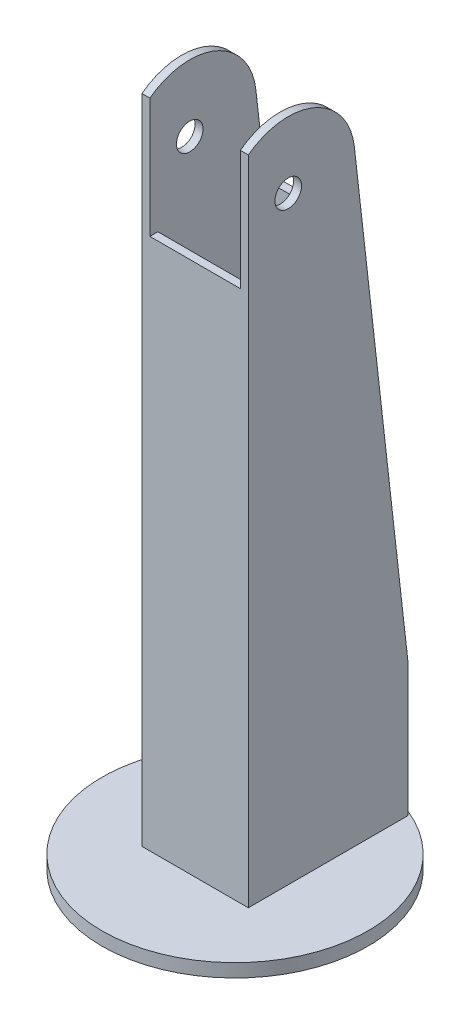
ISO-10303-21;
HEADER;
FILE_DESCRIPTION(('STEP AP214'),'2;1');
FILE_NAME('part.step','',(''),(''),'','','');
FILE_SCHEMA(('AUTOMOTIVE_DESIGN { 1 0 10303 214 1 1 1 1 }'));
ENDSEC;
DATA;
#1=APPLICATION_CONTEXT('core data for automotive mechanical design processes');
#2=APPLICATION_PROTOCOL_DEFINITION('international standard','automotive_design',2000,#1);
#3=PRODUCT_CONTEXT('',#1,'mechanical');
#4=PRODUCT('Part','Part','',(#3));
#5=PRODUCT_RELATED_PRODUCT_CATEGORY('part','',(#4));
#6=PRODUCT_DEFINITION_FORMATION('','',#4);
#7=PRODUCT_DEFINITION_CONTEXT('part definition',#1,'design');
#8=PRODUCT_DEFINITION('design','',#6,#7);
#9=PRODUCT_DEFINITION_SHAPE('','',#8);
#10=(LENGTH_UNIT() NAMED_UNIT(*) SI_UNIT(.MILLI.,.METRE.));
#11=(NAMED_UNIT(*) PLANE_ANGLE_UNIT() SI_UNIT($,.RADIAN.));
#12=(NAMED_UNIT(*) SI_UNIT($,.STERADIAN.) SOLID_ANGLE_UNIT());
#13=UNCERTAINTY_MEASURE_WITH_UNIT(LENGTH_MEASURE(1.E-05),#10,'distance_accuracy_value','');
#14=(GEOMETRIC_REPRESENTATION_CONTEXT(3) GLOBAL_UNCERTAINTY_ASSIGNED_CONTEXT((#13)) GLOBAL_UNIT_ASSIGNED_CONTEXT((#10,
#11,#12)) REPRESENTATION_CONTEXT('',''));
#15=CARTESIAN_POINT('',(0.,0.,0.));
#16=DIRECTION('',(0.,0.,1.));
#17=DIRECTION('',(1.,0.,0.));
#18=AXIS2_PLACEMENT_3D('',#15,#16,#17);
#19=CARTESIAN_POINT('',(-17.,200.,-30.));
#20=DIRECTION('',(0.,-1.,0.));
#21=DIRECTION('',(0.,0.,-1.));
#22=AXIS2_PLACEMENT_3D('',#19,#20,#21);
#23=PLANE('',#22);
#24=DIRECTION('',(0.,0.,1.));
#25=VECTOR('',#24,1.);
#26=CARTESIAN_POINT('',(-17.,200.,30.));
#27=LINE('',#26,#25);
#28=CARTESIAN_POINT('',(-17.,200.,-12.9944127102166));
#29=VERTEX_POINT('',#28);
#30=CARTESIAN_POINT('',(-17.,200.,-9.9944127102166));
#31=VERTEX_POINT('',#30);
#32=EDGE_CURVE('E201',#29,#31,#27,.T.);
#33=ORIENTED_EDGE('',*,*,#32,.T.);
#34=DIRECTION('',(-1.,0.,0.));
#35=VECTOR('',#34,1.);
#36=CARTESIAN_POINT('',(17.,200.,-9.99441271021659));
#37=LINE('',#36,#35);
#38=CARTESIAN_POINT('',(17.,200.,-9.99441271021659));
#39=VERTEX_POINT('',#38);
#40=EDGE_CURVE('E146',#39,#31,#37,.T.);
#41=ORIENTED_EDGE('',*,*,#40,.F.);
#42=DIRECTION('',(0.,0.,-1.));
#43=VECTOR('',#42,1.);
#44=CARTESIAN_POINT('',(17.,200.,30.));
#45=LINE('',#44,#43);
#46=CARTESIAN_POINT('',(17.,200.,-12.9944127102166));
#47=VERTEX_POINT('',#46);
#48=EDGE_CURVE('E207',#39,#47,#45,.T.);
#49=ORIENTED_EDGE('',*,*,#48,.T.);
#50=DIRECTION('',(1.,0.,0.));
#51=VECTOR('',#50,1.);
#52=CARTESIAN_POINT('',(-17.,200.,-12.9944127102166));
#53=LINE('',#52,#51);
#54=EDGE_CURVE('E241',#29,#47,#53,.T.);
#55=ORIENTED_EDGE('',*,*,#54,.F.);
#56=EDGE_LOOP('',(#33,#41,#49,#55));
#57=FACE_BOUND('',#56,.T.);
#58=ADVANCED_FACE('F33',(#57),#23,.F.);
#59=CARTESIAN_POINT('',(20.,250.,30.));
#60=DIRECTION('',(-1.,0.,0.));
#61=DIRECTION('',(0.,0.,1.));
#62=AXIS2_PLACEMENT_3D('',#59,#60,#61);
#63=PLANE('',#62);
#64=CARTESIAN_POINT('',(20.,225.,15.));
#65=DIRECTION('',(1.,0.,0.));
#66=DIRECTION('',(0.,0.,-1.));
#67=AXIS2_PLACEMENT_3D('',#64,#65,#66);
#68=CIRCLE('',#67,5.);
#69=CARTESIAN_POINT('',(20.,225.,10.));
#70=VERTEX_POINT('',#69);
#71=EDGE_CURVE('E191',#70,#70,#68,.T.);
#72=ORIENTED_EDGE('',*,*,#71,.F.);
#73=EDGE_LOOP('',(#72));
#74=FACE_BOUND('',#73,.T.);
#75=CARTESIAN_POINT('',(20.,225.,15.));
#76=DIRECTION('',(1.,0.,0.));
#77=DIRECTION('',(0.,0.,-1.));
#78=AXIS2_PLACEMENT_3D('',#75,#76,#77);
#79=CIRCLE('',#78,25.);
#80=CARTESIAN_POINT('',(20.,227.816224024256,-9.84087120543892));
#81=VERTEX_POINT('',#80);
#82=CARTESIAN_POINT('',(20.,245.,30.));
#83=VERTEX_POINT('',#82);
#84=EDGE_CURVE('E169',#81,#83,#79,.T.);
#85=ORIENTED_EDGE('',*,*,#84,.T.);
#86=DIRECTION('',(0.,-1.,0.));
#87=VECTOR('',#86,1.);
#88=CARTESIAN_POINT('',(20.,250.,30.));
#89=LINE('',#88,#87);
#90=CARTESIAN_POINT('',(20.,0.,30.));
#91=VERTEX_POINT('',#90);
#92=EDGE_CURVE('E229',#83,#91,#89,.T.);
#93=ORIENTED_EDGE('',*,*,#92,.T.);
#94=DIRECTION('',(0.,0.,-1.));
#95=VECTOR('',#94,1.);
#96=CARTESIAN_POINT('',(20.,0.,30.));
#97=LINE('',#96,#95);
#98=CARTESIAN_POINT('',(20.,0.,-30.));
#99=VERTEX_POINT('',#98);
#100=EDGE_CURVE('E215',#91,#99,#97,.T.);
#101=ORIENTED_EDGE('',*,*,#100,.T.);
#102=DIRECTION('',(0.,-1.,0.));
#103=VECTOR('',#102,1.);
#104=CARTESIAN_POINT('',(20.,250.,-30.));
#105=LINE('',#104,#103);
#106=CARTESIAN_POINT('',(20.,50.0000000000004,-30.));
#107=VERTEX_POINT('',#106);
#108=EDGE_CURVE('E238',#107,#99,#105,.T.);
#109=ORIENTED_EDGE('',*,*,#108,.F.);
#110=DIRECTION('',(0.,0.993634848217557,0.112648960970229));
#111=VECTOR('',#110,1.);
#112=CARTESIAN_POINT('',(20.,105.006666194857,-23.7638622433559));
#113=LINE('',#112,#111);
#114=EDGE_CURVE('E173',#107,#81,#113,.T.);
#115=ORIENTED_EDGE('',*,*,#114,.T.);
#116=EDGE_LOOP('',(#85,#93,#101,#109,#115));
#117=FACE_BOUND('',#116,.T.);
#118=ADVANCED_FACE('F35',(#74,#117),#63,.F.);
#119=CARTESIAN_POINT('',(-20.,250.,30.));
#120=DIRECTION('',(1.,0.,0.));
#121=DIRECTION('',(0.,0.,-1.));
#122=AXIS2_PLACEMENT_3D('',#119,#120,#121);
#123=PLANE('',#122);
#124=CARTESIAN_POINT('',(-20.,225.,15.));
#125=DIRECTION('',(1.,0.,0.));
#126=DIRECTION('',(0.,0.,-1.));
#127=AXIS2_PLACEMENT_3D('',#124,#125,#126);
#128=CIRCLE('',#127,5.);
#129=CARTESIAN_POINT('',(-20.,225.,10.));
#130=VERTEX_POINT('',#129);
#131=EDGE_CURVE('E192',#130,#130,#128,.T.);
#132=ORIENTED_EDGE('',*,*,#131,.T.);
#133=EDGE_LOOP('',(#132));
#134=FACE_BOUND('',#133,.T.);
#135=DIRECTION('',(0.,-1.,0.));
#136=VECTOR('',#135,1.);
#137=CARTESIAN_POINT('',(-20.,250.,30.));
#138=LINE('',#137,#136);
#139=CARTESIAN_POINT('',(-20.,245.,30.));
#140=VERTEX_POINT('',#139);
#141=CARTESIAN_POINT('',(-20.,0.,30.));
#142=VERTEX_POINT('',#141);
#143=EDGE_CURVE('E232',#140,#142,#138,.T.);
#144=ORIENTED_EDGE('',*,*,#143,.F.);
#145=CARTESIAN_POINT('',(-20.,225.,15.));
#146=DIRECTION('',(1.,0.,0.));
#147=DIRECTION('',(0.,0.,-1.));
#148=AXIS2_PLACEMENT_3D('',#145,#146,#147);
#149=CIRCLE('',#148,25.);
#150=CARTESIAN_POINT('',(-20.,227.816224024256,-9.84087120543892));
#151=VERTEX_POINT('',#150);
#152=EDGE_CURVE('E170',#151,#140,#149,.T.);
#153=ORIENTED_EDGE('',*,*,#152,.F.);
#154=DIRECTION('',(0.,0.993634848217557,0.112648960970229));
#155=VECTOR('',#154,1.);
#156=CARTESIAN_POINT('',(-20.,105.006666194857,-23.7638622433559));
#157=LINE('',#156,#155);
#158=CARTESIAN_POINT('',(-20.,50.0000000000004,-30.));
#159=VERTEX_POINT('',#158);
#160=EDGE_CURVE('E172',#159,#151,#157,.T.);
#161=ORIENTED_EDGE('',*,*,#160,.F.);
#162=DIRECTION('',(0.,-1.,0.));
#163=VECTOR('',#162,1.);
#164=CARTESIAN_POINT('',(-20.,250.,-30.));
#165=LINE('',#164,#163);
#166=CARTESIAN_POINT('',(-20.,0.,-30.));
#167=VERTEX_POINT('',#166);
#168=EDGE_CURVE('E235',#159,#167,#165,.T.);
#169=ORIENTED_EDGE('',*,*,#168,.T.);
#170=DIRECTION('',(0.,0.,1.));
#171=VECTOR('',#170,1.);
#172=CARTESIAN_POINT('',(-20.,0.,30.));
#173=LINE('',#172,#171);
#174=EDGE_CURVE('E223',#167,#142,#173,.T.);
#175=ORIENTED_EDGE('',*,*,#174,.T.);
#176=EDGE_LOOP('',(#144,#153,#161,#169,#175));
#177=FACE_BOUND('',#176,.T.);
#178=ADVANCED_FACE('F270',(#134,#177),#123,.F.);
#179=CARTESIAN_POINT('',(-17.,200.,30.));
#180=DIRECTION('',(-1.,0.,0.));
#181=DIRECTION('',(0.,0.,1.));
#182=AXIS2_PLACEMENT_3D('',#179,#180,#181);
#183=PLANE('',#182);
#184=CARTESIAN_POINT('',(-17.,225.,15.));
#185=DIRECTION('',(-1.,0.,0.));
#186=DIRECTION('',(0.,0.,1.));
#187=AXIS2_PLACEMENT_3D('',#184,#185,#186);
#188=CIRCLE('',#187,5.);
#189=CARTESIAN_POINT('',(-17.,225.,20.));
#190=VERTEX_POINT('',#189);
#191=EDGE_CURVE('E198',#190,#190,#188,.T.);
#192=ORIENTED_EDGE('',*,*,#191,.T.);
#193=EDGE_LOOP('',(#192));
#194=FACE_BOUND('',#193,.T.);
#195=CARTESIAN_POINT('',(-17.,225.,15.));
#196=DIRECTION('',(-1.,0.,0.));
#197=DIRECTION('',(0.,0.,1.));
#198=AXIS2_PLACEMENT_3D('',#195,#196,#197);
#199=CIRCLE('',#198,25.);
#200=CARTESIAN_POINT('',(-17.,245.,30.));
#201=VERTEX_POINT('',#200);
#202=CARTESIAN_POINT('',(-17.,227.816224024256,-9.84087120543892));
#203=VERTEX_POINT('',#202);
#204=EDGE_CURVE('E189',#201,#203,#199,.T.);
#205=ORIENTED_EDGE('',*,*,#204,.F.);
#206=DIRECTION('',(0.,1.,0.));
#207=VECTOR('',#206,1.);
#208=CARTESIAN_POINT('',(-17.,200.,30.));
#209=LINE('',#208,#207);
#210=CARTESIAN_POINT('',(-17.,200.,30.));
#211=VERTEX_POINT('',#210);
#212=EDGE_CURVE('E211',#211,#201,#209,.T.);
#213=ORIENTED_EDGE('',*,*,#212,.F.);
#214=CARTESIAN_POINT('',(-17.,200.,27.));
#215=VERTEX_POINT('',#214);
#216=EDGE_CURVE('E134',#215,#211,#27,.T.);
#217=ORIENTED_EDGE('',*,*,#216,.F.);
#218=DIRECTION('',(0.,1.,0.));
#219=VECTOR('',#218,1.);
#220=CARTESIAN_POINT('',(-17.,-5.,27.));
#221=LINE('',#220,#219);
#222=CARTESIAN_POINT('',(-17.,-5.,27.));
#223=VERTEX_POINT('',#222);
#224=EDGE_CURVE('E48',#223,#215,#221,.T.);
#225=ORIENTED_EDGE('',*,*,#224,.F.);
#226=DIRECTION('',(0.,0.,1.));
#227=VECTOR('',#226,1.);
#228=CARTESIAN_POINT('',(-17.,-5.,27.));
#229=LINE('',#228,#227);
#230=CARTESIAN_POINT('',(-17.,-5.,-9.9944127102166));
#231=VERTEX_POINT('',#230);
#232=EDGE_CURVE('E131',#231,#223,#229,.T.);
#233=ORIENTED_EDGE('',*,*,#232,.F.);
#234=DIRECTION('',(0.,1.,0.));
#235=VECTOR('',#234,1.);
#236=CARTESIAN_POINT('',(-17.,-5.,-9.9944127102166));
#237=LINE('',#236,#235);
#238=EDGE_CURVE('E155',#231,#31,#237,.T.);
#239=ORIENTED_EDGE('',*,*,#238,.T.);
#240=ORIENTED_EDGE('',*,*,#32,.F.);
#241=DIRECTION('',(0.,-0.993634848217557,-0.112648960970229));
#242=VECTOR('',#241,1.);
#243=CARTESIAN_POINT('',(-17.,204.81244773298,-12.4488227102118));
#244=LINE('',#243,#242);
#245=EDGE_CURVE('E187',#203,#29,#244,.T.);
#246=ORIENTED_EDGE('',*,*,#245,.F.);
#247=EDGE_LOOP('',(#205,#213,#217,#225,#233,#239,#240,#246));
#248=FACE_BOUND('',#247,.T.);
#249=ADVANCED_FACE('F129',(#194,#248),#183,.F.);
#250=CARTESIAN_POINT('',(17.,200.,30.));
#251=DIRECTION('',(1.,0.,0.));
#252=DIRECTION('',(0.,0.,-1.));
#253=AXIS2_PLACEMENT_3D('',#250,#251,#252);
#254=PLANE('',#253);
#255=CARTESIAN_POINT('',(17.,225.,15.));
#256=DIRECTION('',(1.,0.,0.));
#257=DIRECTION('',(0.,0.,-1.));
#258=AXIS2_PLACEMENT_3D('',#255,#256,#257);
#259=CIRCLE('',#258,5.);
#260=CARTESIAN_POINT('',(17.,225.,10.));
#261=VERTEX_POINT('',#260);
#262=EDGE_CURVE('E195',#261,#261,#259,.T.);
#263=ORIENTED_EDGE('',*,*,#262,.T.);
#264=EDGE_LOOP('',(#263));
#265=FACE_BOUND('',#264,.T.);
#266=DIRECTION('',(0.,1.,0.));
#267=VECTOR('',#266,1.);
#268=CARTESIAN_POINT('',(17.,200.,30.));
#269=LINE('',#268,#267);
#270=CARTESIAN_POINT('',(17.,200.,30.));
#271=VERTEX_POINT('',#270);
#272=CARTESIAN_POINT('',(17.,245.,30.));
#273=VERTEX_POINT('',#272);
#274=EDGE_CURVE('E212',#271,#273,#269,.T.);
#275=ORIENTED_EDGE('',*,*,#274,.T.);
#276=CARTESIAN_POINT('',(17.,225.,15.));
#277=DIRECTION('',(1.,0.,0.));
#278=DIRECTION('',(0.,0.,-1.));
#279=AXIS2_PLACEMENT_3D('',#276,#277,#278);
#280=CIRCLE('',#279,25.);
#281=CARTESIAN_POINT('',(17.,227.816224024256,-9.84087120543892));
#282=VERTEX_POINT('',#281);
#283=EDGE_CURVE('E41',#282,#273,#280,.T.);
#284=ORIENTED_EDGE('',*,*,#283,.F.);
#285=DIRECTION('',(0.,0.993634848217557,0.112648960970229));
#286=VECTOR('',#285,1.);
#287=CARTESIAN_POINT('',(17.,204.81244773298,-12.4488227102118));
#288=LINE('',#287,#286);
#289=EDGE_CURVE('E182',#47,#282,#288,.T.);
#290=ORIENTED_EDGE('',*,*,#289,.F.);
#291=ORIENTED_EDGE('',*,*,#48,.F.);
#292=DIRECTION('',(0.,1.,0.));
#293=VECTOR('',#292,1.);
#294=CARTESIAN_POINT('',(17.,-5.,-9.99441271021659));
#295=LINE('',#294,#293);
#296=CARTESIAN_POINT('',(17.,-5.,-9.99441271021659));
#297=VERTEX_POINT('',#296);
#298=EDGE_CURVE('E158',#297,#39,#295,.T.);
#299=ORIENTED_EDGE('',*,*,#298,.F.);
#300=DIRECTION('',(0.,0.,-1.));
#301=VECTOR('',#300,1.);
#302=CARTESIAN_POINT('',(17.,-5.,27.));
#303=LINE('',#302,#301);
#304=CARTESIAN_POINT('',(17.,-5.,27.));
#305=VERTEX_POINT('',#304);
#306=EDGE_CURVE('E56',#305,#297,#303,.T.);
#307=ORIENTED_EDGE('',*,*,#306,.F.);
#308=DIRECTION('',(0.,1.,0.));
#309=VECTOR('',#308,1.);
#310=CARTESIAN_POINT('',(17.,-5.,27.));
#311=LINE('',#310,#309);
#312=CARTESIAN_POINT('',(17.,200.,27.));
#313=VERTEX_POINT('',#312);
#314=EDGE_CURVE('E135',#305,#313,#311,.T.);
#315=ORIENTED_EDGE('',*,*,#314,.T.);
#316=EDGE_CURVE('E208',#271,#313,#45,.T.);
#317=ORIENTED_EDGE('',*,*,#316,.F.);
#318=EDGE_LOOP('',(#275,#284,#290,#291,#299,#307,#315,#317));
#319=FACE_BOUND('',#318,.T.);
#320=ADVANCED_FACE('F258',(#265,#319),#254,.F.);
#321=CARTESIAN_POINT('',(-20.,250.,30.));
#322=DIRECTION('',(0.,0.,-1.));
#323=DIRECTION('',(-1.,0.,0.));
#324=AXIS2_PLACEMENT_3D('',#321,#322,#323);
#325=PLANE('',#324);
#326=DIRECTION('',(1.,0.,0.));
#327=VECTOR('',#326,1.);
#328=CARTESIAN_POINT('',(-20.,245.,30.));
#329=LINE('',#328,#327);
#330=EDGE_CURVE('E164',#140,#201,#329,.T.);
#331=ORIENTED_EDGE('',*,*,#330,.F.);
#332=ORIENTED_EDGE('',*,*,#143,.T.);
#333=DIRECTION('',(1.,0.,0.));
#334=VECTOR('',#333,1.);
#335=CARTESIAN_POINT('',(-20.,0.,30.));
#336=LINE('',#335,#334);
#337=EDGE_CURVE('E226',#142,#91,#336,.T.);
#338=ORIENTED_EDGE('',*,*,#337,.T.);
#339=ORIENTED_EDGE('',*,*,#92,.F.);
#340=DIRECTION('',(1.,0.,0.));
#341=VECTOR('',#340,1.);
#342=CARTESIAN_POINT('',(-20.,245.,30.));
#343=LINE('',#342,#341);
#344=EDGE_CURVE('E11',#273,#83,#343,.T.);
#345=ORIENTED_EDGE('',*,*,#344,.F.);
#346=ORIENTED_EDGE('',*,*,#274,.F.);
#347=DIRECTION('',(1.,0.,0.));
#348=VECTOR('',#347,1.);
#349=CARTESIAN_POINT('',(-17.,200.,30.));
#350=LINE('',#349,#348);
#351=EDGE_CURVE('E204',#211,#271,#350,.T.);
#352=ORIENTED_EDGE('',*,*,#351,.F.);
#353=ORIENTED_EDGE('',*,*,#212,.T.);
#354=EDGE_LOOP('',(#331,#332,#338,#339,#345,#346,#352,#353));
#355=FACE_BOUND('',#354,.T.);
#356=ADVANCED_FACE('F256',(#355),#325,.F.);
#357=CARTESIAN_POINT('',(-20.,250.,-30.));
#358=DIRECTION('',(0.,0.,1.));
#359=DIRECTION('',(1.,0.,0.));
#360=AXIS2_PLACEMENT_3D('',#357,#358,#359);
#361=PLANE('',#360);
#362=DIRECTION('',(1.,0.,0.));
#363=VECTOR('',#362,1.);
#364=CARTESIAN_POINT('',(-20.,50.0000000000004,-30.));
#365=LINE('',#364,#363);
#366=EDGE_CURVE('E179',#159,#107,#365,.T.);
#367=ORIENTED_EDGE('',*,*,#366,.T.);
#368=ORIENTED_EDGE('',*,*,#108,.T.);
#369=DIRECTION('',(-1.,0.,0.));
#370=VECTOR('',#369,1.);
#371=CARTESIAN_POINT('',(-20.,0.,-30.));
#372=LINE('',#371,#370);
#373=EDGE_CURVE('E220',#99,#167,#372,.T.);
#374=ORIENTED_EDGE('',*,*,#373,.T.);
#375=ORIENTED_EDGE('',*,*,#168,.F.);
#376=EDGE_LOOP('',(#367,#368,#374,#375));
#377=FACE_BOUND('',#376,.T.);
#378=ADVANCED_FACE('F279',(#377),#361,.F.);
#379=ORIENTED_EDGE('',*,*,#316,.T.);
#380=DIRECTION('',(1.,0.,0.));
#381=VECTOR('',#380,1.);
#382=CARTESIAN_POINT('',(17.,200.,27.));
#383=LINE('',#382,#381);
#384=EDGE_CURVE('E149',#215,#313,#383,.T.);
#385=ORIENTED_EDGE('',*,*,#384,.F.);
#386=ORIENTED_EDGE('',*,*,#216,.T.);
#387=ORIENTED_EDGE('',*,*,#351,.T.);
#388=EDGE_LOOP('',(#379,#385,#386,#387));
#389=FACE_BOUND('',#388,.T.);
#390=ADVANCED_FACE('F260',(#389),#23,.F.);
#391=CARTESIAN_POINT('',(-20.,225.,15.));
#392=DIRECTION('',(1.,0.,0.));
#393=DIRECTION('',(0.,0.,-1.));
#394=AXIS2_PLACEMENT_3D('',#391,#392,#393);
#395=CYLINDRICAL_SURFACE('',#394,5.);
#396=ORIENTED_EDGE('',*,*,#71,.T.);
#397=EDGE_LOOP('',(#396));
#398=FACE_BOUND('',#397,.T.);
#399=ORIENTED_EDGE('',*,*,#262,.F.);
#400=EDGE_LOOP('',(#399));
#401=FACE_BOUND('',#400,.T.);
#402=ADVANCED_FACE('F285',(#398,#401),#395,.F.);
#403=ORIENTED_EDGE('',*,*,#131,.F.);
#404=EDGE_LOOP('',(#403));
#405=FACE_BOUND('',#404,.T.);
#406=ORIENTED_EDGE('',*,*,#191,.F.);
#407=EDGE_LOOP('',(#406));
#408=FACE_BOUND('',#407,.T.);
#409=ADVANCED_FACE('F297',(#405,#408),#395,.F.);
#410=CARTESIAN_POINT('',(-20.,225.,15.));
#411=DIRECTION('',(1.,0.,0.));
#412=DIRECTION('',(0.,0.,-1.));
#413=AXIS2_PLACEMENT_3D('',#410,#411,#412);
#414=CYLINDRICAL_SURFACE('',#413,25.);
#415=ORIENTED_EDGE('',*,*,#204,.T.);
#416=DIRECTION('',(1.,0.,0.));
#417=VECTOR('',#416,1.);
#418=CARTESIAN_POINT('',(-20.,227.816224024256,-9.84087120543892));
#419=LINE('',#418,#417);
#420=EDGE_CURVE('E183',#151,#203,#419,.T.);
#421=ORIENTED_EDGE('',*,*,#420,.F.);
#422=ORIENTED_EDGE('',*,*,#152,.T.);
#423=ORIENTED_EDGE('',*,*,#330,.T.);
#424=EDGE_LOOP('',(#415,#421,#422,#423));
#425=FACE_BOUND('',#424,.T.);
#426=ADVANCED_FACE('F266',(#425),#414,.T.);
#427=ORIENTED_EDGE('',*,*,#283,.T.);
#428=ORIENTED_EDGE('',*,*,#344,.T.);
#429=ORIENTED_EDGE('',*,*,#84,.F.);
#430=EDGE_CURVE('E175',#282,#81,#419,.T.);
#431=ORIENTED_EDGE('',*,*,#430,.F.);
#432=EDGE_LOOP('',(#427,#428,#429,#431));
#433=FACE_BOUND('',#432,.T.);
#434=ADVANCED_FACE('F249',(#433),#414,.T.);
#435=CARTESIAN_POINT('',(-20.,105.006666194857,-23.7638622433559));
#436=DIRECTION('',(0.,0.112648960970229,-0.993634848217557));
#437=DIRECTION('',(0.,0.993634848217557,0.112648960970229));
#438=AXIS2_PLACEMENT_3D('',#435,#436,#437);
#439=PLANE('',#438);
#440=ORIENTED_EDGE('',*,*,#245,.T.);
#441=ORIENTED_EDGE('',*,*,#54,.T.);
#442=ORIENTED_EDGE('',*,*,#289,.T.);
#443=ORIENTED_EDGE('',*,*,#430,.T.);
#444=ORIENTED_EDGE('',*,*,#114,.F.);
#445=ORIENTED_EDGE('',*,*,#366,.F.);
#446=ORIENTED_EDGE('',*,*,#160,.T.);
#447=ORIENTED_EDGE('',*,*,#420,.T.);
#448=EDGE_LOOP('',(#440,#441,#442,#443,#444,#445,#446,#447));
#449=FACE_BOUND('',#448,.T.);
#450=ADVANCED_FACE('F277',(#449),#439,.T.);
#451=CARTESIAN_POINT('',(0.,0.,15.));
#452=DIRECTION('',(0.,-1.,0.));
#453=DIRECTION('',(0.,0.,-1.));
#454=AXIS2_PLACEMENT_3D('',#451,#452,#453);
#455=PLANE('',#454);
#456=CARTESIAN_POINT('',(0.,0.,15.));
#457=DIRECTION('',(0.,-1.,0.));
#458=DIRECTION('',(0.,0.,-1.));
#459=AXIS2_PLACEMENT_3D('',#456,#457,#458);
#460=CIRCLE('',#459,50.);
#461=CARTESIAN_POINT('',(0.,0.,-35.));
#462=VERTEX_POINT('',#461);
#463=EDGE_CURVE('E157',#462,#462,#460,.T.);
#464=ORIENTED_EDGE('',*,*,#463,.F.);
#465=EDGE_LOOP('',(#464));
#466=FACE_BOUND('',#465,.T.);
#467=ORIENTED_EDGE('',*,*,#100,.F.);
#468=ORIENTED_EDGE('',*,*,#337,.F.);
#469=ORIENTED_EDGE('',*,*,#174,.F.);
#470=ORIENTED_EDGE('',*,*,#373,.F.);
#471=EDGE_LOOP('',(#467,#468,#469,#470));
#472=FACE_BOUND('',#471,.T.);
#473=ADVANCED_FACE('F273',(#466,#472),#455,.F.);
#474=CARTESIAN_POINT('',(0.,-5.,15.));
#475=DIRECTION('',(0.,1.,0.));
#476=DIRECTION('',(0.,0.,1.));
#477=AXIS2_PLACEMENT_3D('',#474,#475,#476);
#478=CYLINDRICAL_SURFACE('',#477,50.);
#479=CARTESIAN_POINT('',(0.,-5.,15.));
#480=DIRECTION('',(0.,-1.,0.));
#481=DIRECTION('',(0.,0.,-1.));
#482=AXIS2_PLACEMENT_3D('',#479,#480,#481);
#483=CIRCLE('',#482,50.);
#484=CARTESIAN_POINT('',(0.,-5.,-35.));
#485=VERTEX_POINT('',#484);
#486=EDGE_CURVE('E161',#485,#485,#483,.T.);
#487=ORIENTED_EDGE('',*,*,#486,.F.);
#488=EDGE_LOOP('',(#487));
#489=FACE_BOUND('',#488,.T.);
#490=ORIENTED_EDGE('',*,*,#463,.T.);
#491=EDGE_LOOP('',(#490));
#492=FACE_BOUND('',#491,.T.);
#493=ADVANCED_FACE('F343',(#489,#492),#478,.T.);
#494=CARTESIAN_POINT('',(0.,-5.,15.));
#495=DIRECTION('',(0.,-1.,0.));
#496=DIRECTION('',(0.,0.,-1.));
#497=AXIS2_PLACEMENT_3D('',#494,#495,#496);
#498=PLANE('',#497);
#499=ORIENTED_EDGE('',*,*,#232,.T.);
#500=DIRECTION('',(1.,0.,0.));
#501=VECTOR('',#500,1.);
#502=CARTESIAN_POINT('',(17.,-5.,27.));
#503=LINE('',#502,#501);
#504=EDGE_CURVE('E139',#223,#305,#503,.T.);
#505=ORIENTED_EDGE('',*,*,#504,.T.);
#506=ORIENTED_EDGE('',*,*,#306,.T.);
#507=DIRECTION('',(-1.,0.,0.));
#508=VECTOR('',#507,1.);
#509=CARTESIAN_POINT('',(17.,-5.,-9.99441271021659));
#510=LINE('',#509,#508);
#511=EDGE_CURVE('E136',#297,#231,#510,.T.);
#512=ORIENTED_EDGE('',*,*,#511,.T.);
#513=EDGE_LOOP('',(#499,#505,#506,#512));
#514=FACE_BOUND('',#513,.T.);
#515=ORIENTED_EDGE('',*,*,#486,.T.);
#516=EDGE_LOOP('',(#515));
#517=FACE_BOUND('',#516,.T.);
#518=ADVANCED_FACE('F143',(#514,#517),#498,.T.);
#519=CARTESIAN_POINT('',(17.,-5.,-9.99441271021659));
#520=DIRECTION('',(0.,0.,-1.));
#521=DIRECTION('',(-1.,0.,0.));
#522=AXIS2_PLACEMENT_3D('',#519,#520,#521);
#523=PLANE('',#522);
#524=ORIENTED_EDGE('',*,*,#40,.T.);
#525=ORIENTED_EDGE('',*,*,#238,.F.);
#526=ORIENTED_EDGE('',*,*,#511,.F.);
#527=ORIENTED_EDGE('',*,*,#298,.T.);
#528=EDGE_LOOP('',(#524,#525,#526,#527));
#529=FACE_BOUND('',#528,.T.);
#530=ADVANCED_FACE('F342',(#529),#523,.F.);
#531=CARTESIAN_POINT('',(17.,-5.,27.));
#532=DIRECTION('',(0.,0.,1.));
#533=DIRECTION('',(1.,0.,0.));
#534=AXIS2_PLACEMENT_3D('',#531,#532,#533);
#535=PLANE('',#534);
#536=ORIENTED_EDGE('',*,*,#384,.T.);
#537=ORIENTED_EDGE('',*,*,#314,.F.);
#538=ORIENTED_EDGE('',*,*,#504,.F.);
#539=ORIENTED_EDGE('',*,*,#224,.T.);
#540=EDGE_LOOP('',(#536,#537,#538,#539));
#541=FACE_BOUND('',#540,.T.);
#542=ADVANCED_FACE('F140',(#541),#535,.F.);
#543=CLOSED_SHELL('',(#58,#118,#178,#249,#320,#356,#378,#390,#402,#409,#426,#434,#450,#473,#493,
#518,#530,#542));
#544=MANIFOLD_SOLID_BREP('B2',#543);
#545=ADVANCED_BREP_SHAPE_REPRESENTATION('',(#18,#544),#14);
#546=SHAPE_DEFINITION_REPRESENTATION(#9,#545);
ENDSEC;
END-ISO-10303-21;
